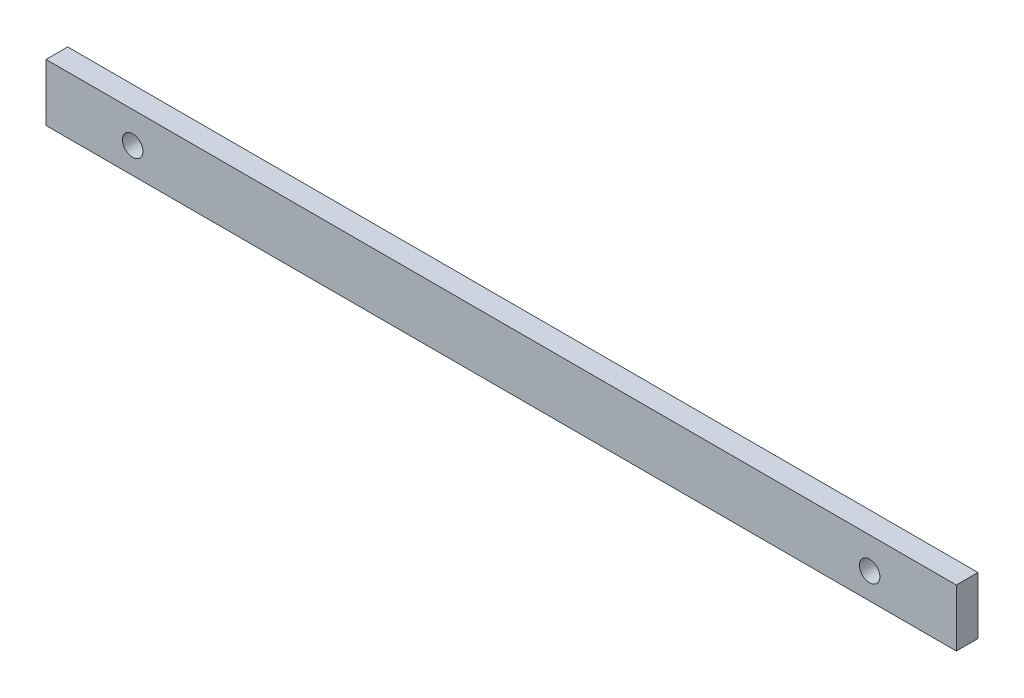
ISO-10303-21;
HEADER;
FILE_DESCRIPTION(('STEP AP214'),'2;1');
FILE_NAME('part.step','',(''),(''),'','','');
FILE_SCHEMA(('AUTOMOTIVE_DESIGN { 1 0 10303 214 1 1 1 1 }'));
ENDSEC;
DATA;
#1=APPLICATION_CONTEXT('core data for automotive mechanical design processes');
#2=APPLICATION_PROTOCOL_DEFINITION('international standard','automotive_design',2000,#1);
#3=PRODUCT_CONTEXT('',#1,'mechanical');
#4=PRODUCT('Part','Part','',(#3));
#5=PRODUCT_RELATED_PRODUCT_CATEGORY('part','',(#4));
#6=PRODUCT_DEFINITION_FORMATION('','',#4);
#7=PRODUCT_DEFINITION_CONTEXT('part definition',#1,'design');
#8=PRODUCT_DEFINITION('design','',#6,#7);
#9=PRODUCT_DEFINITION_SHAPE('','',#8);
#10=(LENGTH_UNIT() NAMED_UNIT(*) SI_UNIT(.MILLI.,.METRE.));
#11=(NAMED_UNIT(*) PLANE_ANGLE_UNIT() SI_UNIT($,.RADIAN.));
#12=(NAMED_UNIT(*) SI_UNIT($,.STERADIAN.) SOLID_ANGLE_UNIT());
#13=UNCERTAINTY_MEASURE_WITH_UNIT(LENGTH_MEASURE(1.E-05),#10,'distance_accuracy_value','');
#14=(GEOMETRIC_REPRESENTATION_CONTEXT(3) GLOBAL_UNCERTAINTY_ASSIGNED_CONTEXT((#13)) GLOBAL_UNIT_ASSIGNED_CONTEXT((#10,
#11,#12)) REPRESENTATION_CONTEXT('',''));
#15=CARTESIAN_POINT('',(0.,0.,0.));
#16=DIRECTION('',(0.,0.,1.));
#17=DIRECTION('',(1.,0.,0.));
#18=AXIS2_PLACEMENT_3D('',#15,#16,#17);
#19=CARTESIAN_POINT('',(0.,4.191,3.175));
#20=DIRECTION('',(0.,-1.,0.));
#21=DIRECTION('',(0.,0.,-1.));
#22=AXIS2_PLACEMENT_3D('',#19,#20,#21);
#23=PLANE('',#22);
#24=DIRECTION('',(-1.,0.,0.));
#25=VECTOR('',#24,1.);
#26=CARTESIAN_POINT('',(0.,4.191,0.));
#27=LINE('',#26,#25);
#28=CARTESIAN_POINT('',(66.6749999999999,4.19100000000001,0.));
#29=VERTEX_POINT('',#28);
#30=CARTESIAN_POINT('',(-66.6750000000001,4.191,0.));
#31=VERTEX_POINT('',#30);
#32=EDGE_CURVE('E106',#29,#31,#27,.T.);
#33=ORIENTED_EDGE('',*,*,#32,.T.);
#34=DIRECTION('',(0.,0.,-1.));
#35=VECTOR('',#34,1.);
#36=CARTESIAN_POINT('',(-66.6750000000001,4.191,3.175));
#37=LINE('',#36,#35);
#38=CARTESIAN_POINT('',(-66.6750000000001,4.191,3.175));
#39=VERTEX_POINT('',#38);
#40=EDGE_CURVE('E11',#39,#31,#37,.T.);
#41=ORIENTED_EDGE('',*,*,#40,.F.);
#42=DIRECTION('',(-1.,0.,0.));
#43=VECTOR('',#42,1.);
#44=CARTESIAN_POINT('',(0.,4.191,3.175));
#45=LINE('',#44,#43);
#46=CARTESIAN_POINT('',(66.6749999999999,4.19100000000001,3.175));
#47=VERTEX_POINT('',#46);
#48=EDGE_CURVE('E86',#47,#39,#45,.T.);
#49=ORIENTED_EDGE('',*,*,#48,.F.);
#50=DIRECTION('',(0.,0.,-1.));
#51=VECTOR('',#50,1.);
#52=CARTESIAN_POINT('',(66.6749999999999,4.19100000000001,3.175));
#53=LINE('',#52,#51);
#54=EDGE_CURVE('E52',#47,#29,#53,.T.);
#55=ORIENTED_EDGE('',*,*,#54,.T.);
#56=EDGE_LOOP('',(#33,#41,#49,#55));
#57=FACE_BOUND('',#56,.T.);
#58=ADVANCED_FACE('F36',(#57),#23,.F.);
#59=CARTESIAN_POINT('',(-66.6750000000001,0.,3.175));
#60=DIRECTION('',(1.,0.,0.));
#61=DIRECTION('',(0.,0.,-1.));
#62=AXIS2_PLACEMENT_3D('',#59,#60,#61);
#63=PLANE('',#62);
#64=DIRECTION('',(0.,-1.,0.));
#65=VECTOR('',#64,1.);
#66=CARTESIAN_POINT('',(-66.6750000000001,0.,0.));
#67=LINE('',#66,#65);
#68=CARTESIAN_POINT('',(-66.6750000000001,-4.191,0.));
#69=VERTEX_POINT('',#68);
#70=EDGE_CURVE('E91',#31,#69,#67,.T.);
#71=ORIENTED_EDGE('',*,*,#70,.T.);
#72=DIRECTION('',(0.,0.,-1.));
#73=VECTOR('',#72,1.);
#74=CARTESIAN_POINT('',(-66.6750000000001,-4.191,3.175));
#75=LINE('',#74,#73);
#76=CARTESIAN_POINT('',(-66.6750000000001,-4.191,3.175));
#77=VERTEX_POINT('',#76);
#78=EDGE_CURVE('E44',#77,#69,#75,.T.);
#79=ORIENTED_EDGE('',*,*,#78,.F.);
#80=DIRECTION('',(0.,-1.,0.));
#81=VECTOR('',#80,1.);
#82=CARTESIAN_POINT('',(-66.6750000000001,0.,3.175));
#83=LINE('',#82,#81);
#84=EDGE_CURVE('E77',#39,#77,#83,.T.);
#85=ORIENTED_EDGE('',*,*,#84,.F.);
#86=ORIENTED_EDGE('',*,*,#40,.T.);
#87=EDGE_LOOP('',(#71,#79,#85,#86));
#88=FACE_BOUND('',#87,.T.);
#89=ADVANCED_FACE('F90',(#88),#63,.F.);
#90=CARTESIAN_POINT('',(0.,-4.191,3.175));
#91=DIRECTION('',(0.,-1.,0.));
#92=DIRECTION('',(0.,0.,-1.));
#93=AXIS2_PLACEMENT_3D('',#90,#91,#92);
#94=PLANE('',#93);
#95=DIRECTION('',(-1.,0.,0.));
#96=VECTOR('',#95,1.);
#97=CARTESIAN_POINT('',(0.,-4.191,0.));
#98=LINE('',#97,#96);
#99=CARTESIAN_POINT('',(66.6749999999999,-4.19099999999999,0.));
#100=VERTEX_POINT('',#99);
#101=EDGE_CURVE('E109',#100,#69,#98,.T.);
#102=ORIENTED_EDGE('',*,*,#101,.F.);
#103=DIRECTION('',(0.,0.,-1.));
#104=VECTOR('',#103,1.);
#105=CARTESIAN_POINT('',(66.6749999999999,-4.19099999999999,3.175));
#106=LINE('',#105,#104);
#107=CARTESIAN_POINT('',(66.6749999999999,-4.19099999999999,3.175));
#108=VERTEX_POINT('',#107);
#109=EDGE_CURVE('E66',#108,#100,#106,.T.);
#110=ORIENTED_EDGE('',*,*,#109,.F.);
#111=DIRECTION('',(-1.,0.,0.));
#112=VECTOR('',#111,1.);
#113=CARTESIAN_POINT('',(0.,-4.191,3.175));
#114=LINE('',#113,#112);
#115=EDGE_CURVE('E85',#108,#77,#114,.T.);
#116=ORIENTED_EDGE('',*,*,#115,.T.);
#117=ORIENTED_EDGE('',*,*,#78,.T.);
#118=EDGE_LOOP('',(#102,#110,#116,#117));
#119=FACE_BOUND('',#118,.T.);
#120=ADVANCED_FACE('F94',(#119),#94,.T.);
#121=CARTESIAN_POINT('',(53.9750000000001,-0.381000000000003,3.175));
#122=DIRECTION('',(0.,0.,-1.));
#123=DIRECTION('',(-1.,0.,0.));
#124=AXIS2_PLACEMENT_3D('',#121,#122,#123);
#125=CYLINDRICAL_SURFACE('',#124,1.5);
#126=CARTESIAN_POINT('',(53.9750000000001,-0.381000000000003,3.175));
#127=DIRECTION('',(0.,0.,1.));
#128=DIRECTION('',(1.,0.,0.));
#129=AXIS2_PLACEMENT_3D('',#126,#127,#128);
#130=CIRCLE('',#129,1.5);
#131=CARTESIAN_POINT('',(55.4750000000001,-0.381000000000003,3.175));
#132=VERTEX_POINT('',#131);
#133=EDGE_CURVE('E97',#132,#132,#130,.T.);
#134=ORIENTED_EDGE('',*,*,#133,.T.);
#135=EDGE_LOOP('',(#134));
#136=FACE_BOUND('',#135,.T.);
#137=CARTESIAN_POINT('',(53.9750000000001,-0.381000000000003,0.));
#138=DIRECTION('',(0.,0.,1.));
#139=DIRECTION('',(1.,0.,0.));
#140=AXIS2_PLACEMENT_3D('',#137,#138,#139);
#141=CIRCLE('',#140,1.5);
#142=CARTESIAN_POINT('',(55.4750000000001,-0.381000000000003,0.));
#143=VERTEX_POINT('',#142);
#144=EDGE_CURVE('E114',#143,#143,#141,.T.);
#145=ORIENTED_EDGE('',*,*,#144,.F.);
#146=EDGE_LOOP('',(#145));
#147=FACE_BOUND('',#146,.T.);
#148=ADVANCED_FACE('F135',(#136,#147),#125,.F.);
#149=CARTESIAN_POINT('',(66.6749999999999,0.,3.175));
#150=DIRECTION('',(1.,0.,0.));
#151=DIRECTION('',(0.,0.,-1.));
#152=AXIS2_PLACEMENT_3D('',#149,#150,#151);
#153=PLANE('',#152);
#154=DIRECTION('',(0.,-1.,0.));
#155=VECTOR('',#154,1.);
#156=CARTESIAN_POINT('',(66.6749999999999,0.,0.));
#157=LINE('',#156,#155);
#158=EDGE_CURVE('E111',#29,#100,#157,.T.);
#159=ORIENTED_EDGE('',*,*,#158,.F.);
#160=ORIENTED_EDGE('',*,*,#54,.F.);
#161=DIRECTION('',(0.,-1.,0.));
#162=VECTOR('',#161,1.);
#163=CARTESIAN_POINT('',(66.6749999999999,0.,3.175));
#164=LINE('',#163,#162);
#165=EDGE_CURVE('E95',#47,#108,#164,.T.);
#166=ORIENTED_EDGE('',*,*,#165,.T.);
#167=ORIENTED_EDGE('',*,*,#109,.T.);
#168=EDGE_LOOP('',(#159,#160,#166,#167));
#169=FACE_BOUND('',#168,.T.);
#170=ADVANCED_FACE('F127',(#169),#153,.T.);
#171=CARTESIAN_POINT('',(-53.9750000000001,-0.381000000000003,3.175));
#172=DIRECTION('',(0.,0.,-1.));
#173=DIRECTION('',(-1.,0.,0.));
#174=AXIS2_PLACEMENT_3D('',#171,#172,#173);
#175=CYLINDRICAL_SURFACE('',#174,1.5);
#176=CARTESIAN_POINT('',(-53.9750000000001,-0.381000000000003,3.175));
#177=DIRECTION('',(0.,0.,1.));
#178=DIRECTION('',(1.,0.,0.));
#179=AXIS2_PLACEMENT_3D('',#176,#177,#178);
#180=CIRCLE('',#179,1.5);
#181=CARTESIAN_POINT('',(-52.4750000000001,-0.381000000000003,3.175));
#182=VERTEX_POINT('',#181);
#183=EDGE_CURVE('E103',#182,#182,#180,.T.);
#184=ORIENTED_EDGE('',*,*,#183,.T.);
#185=EDGE_LOOP('',(#184));
#186=FACE_BOUND('',#185,.T.);
#187=CARTESIAN_POINT('',(-53.9750000000001,-0.381000000000003,0.));
#188=DIRECTION('',(0.,0.,1.));
#189=DIRECTION('',(1.,0.,0.));
#190=AXIS2_PLACEMENT_3D('',#187,#188,#189);
#191=CIRCLE('',#190,1.5);
#192=CARTESIAN_POINT('',(-52.4750000000001,-0.381000000000003,0.));
#193=VERTEX_POINT('',#192);
#194=EDGE_CURVE('E117',#193,#193,#191,.T.);
#195=ORIENTED_EDGE('',*,*,#194,.F.);
#196=EDGE_LOOP('',(#195));
#197=FACE_BOUND('',#196,.T.);
#198=ADVANCED_FACE('F125',(#186,#197),#175,.F.);
#199=CARTESIAN_POINT('',(0.,0.,3.175));
#200=DIRECTION('',(0.,0.,1.));
#201=DIRECTION('',(1.,0.,0.));
#202=AXIS2_PLACEMENT_3D('',#199,#200,#201);
#203=PLANE('',#202);
#204=ORIENTED_EDGE('',*,*,#48,.T.);
#205=ORIENTED_EDGE('',*,*,#84,.T.);
#206=ORIENTED_EDGE('',*,*,#115,.F.);
#207=ORIENTED_EDGE('',*,*,#165,.F.);
#208=EDGE_LOOP('',(#204,#205,#206,#207));
#209=FACE_BOUND('',#208,.T.);
#210=ORIENTED_EDGE('',*,*,#133,.F.);
#211=EDGE_LOOP('',(#210));
#212=FACE_BOUND('',#211,.T.);
#213=ORIENTED_EDGE('',*,*,#183,.F.);
#214=EDGE_LOOP('',(#213));
#215=FACE_BOUND('',#214,.T.);
#216=ADVANCED_FACE('F81',(#209,#212,#215),#203,.T.);
#217=CARTESIAN_POINT('',(0.,0.,0.));
#218=DIRECTION('',(0.,0.,1.));
#219=DIRECTION('',(1.,0.,0.));
#220=AXIS2_PLACEMENT_3D('',#217,#218,#219);
#221=PLANE('',#220);
#222=ORIENTED_EDGE('',*,*,#32,.F.);
#223=ORIENTED_EDGE('',*,*,#158,.T.);
#224=ORIENTED_EDGE('',*,*,#101,.T.);
#225=ORIENTED_EDGE('',*,*,#70,.F.);
#226=EDGE_LOOP('',(#222,#223,#224,#225));
#227=FACE_BOUND('',#226,.T.);
#228=ORIENTED_EDGE('',*,*,#144,.T.);
#229=EDGE_LOOP('',(#228));
#230=FACE_BOUND('',#229,.T.);
#231=ORIENTED_EDGE('',*,*,#194,.T.);
#232=EDGE_LOOP('',(#231));
#233=FACE_BOUND('',#232,.T.);
#234=ADVANCED_FACE('F123',(#227,#230,#233),#221,.F.);
#235=CLOSED_SHELL('',(#58,#89,#120,#148,#170,#198,#216,#234));
#236=MANIFOLD_SOLID_BREP('B2',#235);
#237=ADVANCED_BREP_SHAPE_REPRESENTATION('',(#18,#236),#14);
#238=SHAPE_DEFINITION_REPRESENTATION(#9,#237);
ENDSEC;
END-ISO-10303-21;
